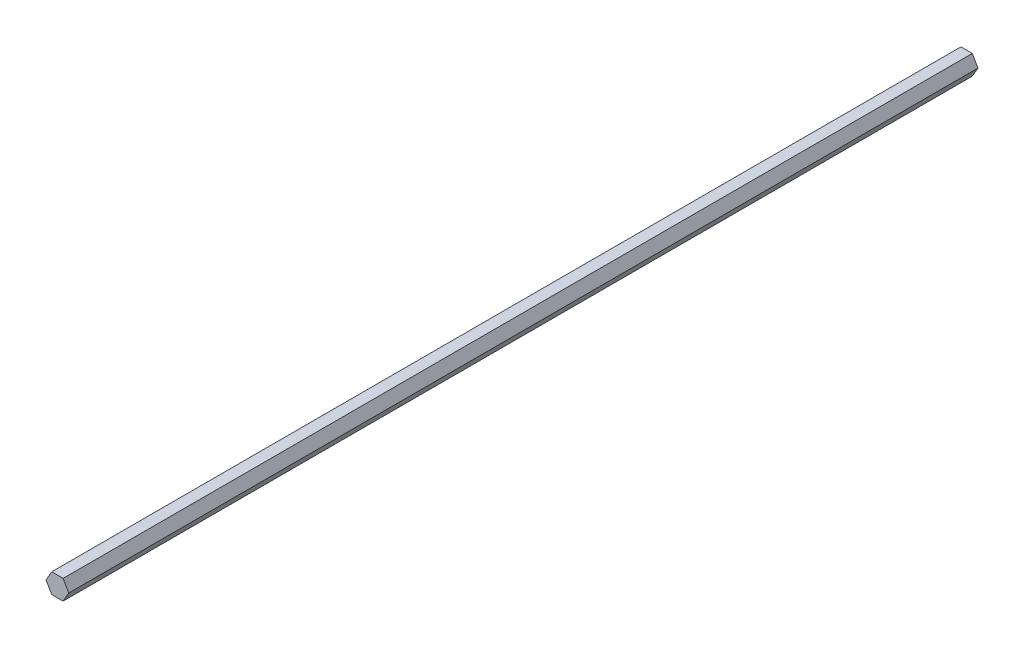
ISO-10303-21;
HEADER;
FILE_DESCRIPTION(('STEP AP214'),'2;1');
FILE_NAME('part.step','',(''),(''),'','','');
FILE_SCHEMA(('AUTOMOTIVE_DESIGN { 1 0 10303 214 1 1 1 1 }'));
ENDSEC;
DATA;
#1=APPLICATION_CONTEXT('core data for automotive mechanical design processes');
#2=APPLICATION_PROTOCOL_DEFINITION('international standard','automotive_design',2000,#1);
#3=PRODUCT_CONTEXT('',#1,'mechanical');
#4=PRODUCT('Part','Part','',(#3));
#5=PRODUCT_RELATED_PRODUCT_CATEGORY('part','',(#4));
#6=PRODUCT_DEFINITION_FORMATION('','',#4);
#7=PRODUCT_DEFINITION_CONTEXT('part definition',#1,'design');
#8=PRODUCT_DEFINITION('design','',#6,#7);
#9=PRODUCT_DEFINITION_SHAPE('','',#8);
#10=(LENGTH_UNIT() NAMED_UNIT(*) SI_UNIT(.MILLI.,.METRE.));
#11=(NAMED_UNIT(*) PLANE_ANGLE_UNIT() SI_UNIT($,.RADIAN.));
#12=(NAMED_UNIT(*) SI_UNIT($,.STERADIAN.) SOLID_ANGLE_UNIT());
#13=UNCERTAINTY_MEASURE_WITH_UNIT(LENGTH_MEASURE(1.E-05),#10,'distance_accuracy_value','');
#14=(GEOMETRIC_REPRESENTATION_CONTEXT(3) GLOBAL_UNCERTAINTY_ASSIGNED_CONTEXT((#13)) GLOBAL_UNIT_ASSIGNED_CONTEXT((#10,
#11,#12)) REPRESENTATION_CONTEXT('',''));
#15=CARTESIAN_POINT('',(0.,0.,0.));
#16=DIRECTION('',(0.,0.,1.));
#17=DIRECTION('',(1.,0.,0.));
#18=AXIS2_PLACEMENT_3D('',#15,#16,#17);
#19=CARTESIAN_POINT('',(-3.66617420935413,-6.35,292.89375));
#20=DIRECTION('',(0.,1.,0.));
#21=DIRECTION('',(0.,0.,1.));
#22=AXIS2_PLACEMENT_3D('',#19,#20,#21);
#23=PLANE('',#22);
#24=DIRECTION('',(1.,0.,0.));
#25=VECTOR('',#24,1.);
#26=CARTESIAN_POINT('',(-3.66617420935413,-6.35,-292.89375));
#27=LINE('',#26,#25);
#28=CARTESIAN_POINT('',(-3.66617420935413,-6.35,-292.89375));
#29=VERTEX_POINT('',#28);
#30=CARTESIAN_POINT('',(3.66617420935412,-6.35,-292.89375));
#31=VERTEX_POINT('',#30);
#32=EDGE_CURVE('E121',#29,#31,#27,.T.);
#33=ORIENTED_EDGE('',*,*,#32,.T.);
#34=DIRECTION('',(0.,0.,-1.));
#35=VECTOR('',#34,1.);
#36=CARTESIAN_POINT('',(3.66617420935412,-6.35,292.89375));
#37=LINE('',#36,#35);
#38=CARTESIAN_POINT('',(3.66617420935412,-6.35,292.89375));
#39=VERTEX_POINT('',#38);
#40=EDGE_CURVE('E11',#39,#31,#37,.T.);
#41=ORIENTED_EDGE('',*,*,#40,.F.);
#42=DIRECTION('',(1.,0.,0.));
#43=VECTOR('',#42,1.);
#44=CARTESIAN_POINT('',(-3.66617420935413,-6.35,292.89375));
#45=LINE('',#44,#43);
#46=CARTESIAN_POINT('',(-3.66617420935413,-6.35,292.89375));
#47=VERTEX_POINT('',#46);
#48=EDGE_CURVE('E131',#47,#39,#45,.T.);
#49=ORIENTED_EDGE('',*,*,#48,.F.);
#50=DIRECTION('',(0.,0.,-1.));
#51=VECTOR('',#50,1.);
#52=CARTESIAN_POINT('',(-3.66617420935413,-6.35,292.89375));
#53=LINE('',#52,#51);
#54=EDGE_CURVE('E117',#47,#29,#53,.T.);
#55=ORIENTED_EDGE('',*,*,#54,.T.);
#56=EDGE_LOOP('',(#33,#41,#49,#55));
#57=FACE_BOUND('',#56,.T.);
#58=ADVANCED_FACE('F37',(#57),#23,.F.);
#59=CARTESIAN_POINT('',(3.66617420935412,-6.35,292.89375));
#60=DIRECTION('',(-0.866025403784438,0.5,0.));
#61=DIRECTION('',(-0.5,-0.866025403784439,0.));
#62=AXIS2_PLACEMENT_3D('',#59,#60,#61);
#63=PLANE('',#62);
#64=DIRECTION('',(0.5,0.866025403784439,0.));
#65=VECTOR('',#64,1.);
#66=CARTESIAN_POINT('',(3.66617420935412,-6.35,-292.89375));
#67=LINE('',#66,#65);
#68=CARTESIAN_POINT('',(7.33234841870825,0.,-292.89375));
#69=VERTEX_POINT('',#68);
#70=EDGE_CURVE('E124',#31,#69,#67,.T.);
#71=ORIENTED_EDGE('',*,*,#70,.T.);
#72=DIRECTION('',(0.,0.,-1.));
#73=VECTOR('',#72,1.);
#74=CARTESIAN_POINT('',(7.33234841870825,0.,292.89375));
#75=LINE('',#74,#73);
#76=CARTESIAN_POINT('',(7.33234841870825,0.,292.89375));
#77=VERTEX_POINT('',#76);
#78=EDGE_CURVE('E45',#77,#69,#75,.T.);
#79=ORIENTED_EDGE('',*,*,#78,.F.);
#80=DIRECTION('',(0.5,0.866025403784439,0.));
#81=VECTOR('',#80,1.);
#82=CARTESIAN_POINT('',(3.66617420935412,-6.35,292.89375));
#83=LINE('',#82,#81);
#84=EDGE_CURVE('E90',#39,#77,#83,.T.);
#85=ORIENTED_EDGE('',*,*,#84,.F.);
#86=ORIENTED_EDGE('',*,*,#40,.T.);
#87=EDGE_LOOP('',(#71,#79,#85,#86));
#88=FACE_BOUND('',#87,.T.);
#89=ADVANCED_FACE('F155',(#88),#63,.F.);
#90=CARTESIAN_POINT('',(7.33234841870825,0.,292.89375));
#91=DIRECTION('',(-0.866025403784439,-0.5,0.));
#92=DIRECTION('',(0.5,-0.866025403784439,0.));
#93=AXIS2_PLACEMENT_3D('',#90,#91,#92);
#94=PLANE('',#93);
#95=DIRECTION('',(-0.5,0.866025403784439,0.));
#96=VECTOR('',#95,1.);
#97=CARTESIAN_POINT('',(7.33234841870825,0.,-292.89375));
#98=LINE('',#97,#96);
#99=CARTESIAN_POINT('',(3.66617420935413,6.35,-292.89375));
#100=VERTEX_POINT('',#99);
#101=EDGE_CURVE('E126',#69,#100,#98,.T.);
#102=ORIENTED_EDGE('',*,*,#101,.T.);
#103=DIRECTION('',(0.,0.,-1.));
#104=VECTOR('',#103,1.);
#105=CARTESIAN_POINT('',(3.66617420935413,6.35,292.89375));
#106=LINE('',#105,#104);
#107=CARTESIAN_POINT('',(3.66617420935413,6.35,292.89375));
#108=VERTEX_POINT('',#107);
#109=EDGE_CURVE('E112',#108,#100,#106,.T.);
#110=ORIENTED_EDGE('',*,*,#109,.F.);
#111=DIRECTION('',(-0.5,0.866025403784439,0.));
#112=VECTOR('',#111,1.);
#113=CARTESIAN_POINT('',(7.33234841870825,0.,292.89375));
#114=LINE('',#113,#112);
#115=EDGE_CURVE('E103',#77,#108,#114,.T.);
#116=ORIENTED_EDGE('',*,*,#115,.F.);
#117=ORIENTED_EDGE('',*,*,#78,.T.);
#118=EDGE_LOOP('',(#102,#110,#116,#117));
#119=FACE_BOUND('',#118,.T.);
#120=ADVANCED_FACE('F137',(#119),#94,.F.);
#121=CARTESIAN_POINT('',(3.66617420935413,6.35,292.89375));
#122=DIRECTION('',(0.,-1.,0.));
#123=DIRECTION('',(1.,0.,0.));
#124=AXIS2_PLACEMENT_3D('',#121,#122,#123);
#125=PLANE('',#124);
#126=DIRECTION('',(-1.,0.,0.));
#127=VECTOR('',#126,1.);
#128=CARTESIAN_POINT('',(3.66617420935413,6.35,-292.89375));
#129=LINE('',#128,#127);
#130=CARTESIAN_POINT('',(-3.66617420935413,6.35,-292.89375));
#131=VERTEX_POINT('',#130);
#132=EDGE_CURVE('E111',#100,#131,#129,.T.);
#133=ORIENTED_EDGE('',*,*,#132,.T.);
#134=DIRECTION('',(0.,0.,-1.));
#135=VECTOR('',#134,1.);
#136=CARTESIAN_POINT('',(-3.66617420935413,6.35,292.89375));
#137=LINE('',#136,#135);
#138=CARTESIAN_POINT('',(-3.66617420935413,6.35,292.89375));
#139=VERTEX_POINT('',#138);
#140=EDGE_CURVE('E108',#139,#131,#137,.T.);
#141=ORIENTED_EDGE('',*,*,#140,.F.);
#142=DIRECTION('',(-1.,0.,0.));
#143=VECTOR('',#142,1.);
#144=CARTESIAN_POINT('',(3.66617420935413,6.35,292.89375));
#145=LINE('',#144,#143);
#146=EDGE_CURVE('E97',#108,#139,#145,.T.);
#147=ORIENTED_EDGE('',*,*,#146,.F.);
#148=ORIENTED_EDGE('',*,*,#109,.T.);
#149=EDGE_LOOP('',(#133,#141,#147,#148));
#150=FACE_BOUND('',#149,.T.);
#151=ADVANCED_FACE('F109',(#150),#125,.F.);
#152=CARTESIAN_POINT('',(-3.66617420935413,6.35,292.89375));
#153=DIRECTION('',(0.866025403784439,-0.5,0.));
#154=DIRECTION('',(0.5,0.866025403784438,0.));
#155=AXIS2_PLACEMENT_3D('',#152,#153,#154);
#156=PLANE('',#155);
#157=DIRECTION('',(-0.5,-0.866025403784439,0.));
#158=VECTOR('',#157,1.);
#159=CARTESIAN_POINT('',(-3.66617420935413,6.35,-292.89375));
#160=LINE('',#159,#158);
#161=CARTESIAN_POINT('',(-7.33234841870825,0.,-292.89375));
#162=VERTEX_POINT('',#161);
#163=EDGE_CURVE('E76',#131,#162,#160,.T.);
#164=ORIENTED_EDGE('',*,*,#163,.T.);
#165=DIRECTION('',(0.,0.,-1.));
#166=VECTOR('',#165,1.);
#167=CARTESIAN_POINT('',(-7.33234841870825,0.,292.89375));
#168=LINE('',#167,#166);
#169=CARTESIAN_POINT('',(-7.33234841870825,0.,292.89375));
#170=VERTEX_POINT('',#169);
#171=EDGE_CURVE('E113',#170,#162,#168,.T.);
#172=ORIENTED_EDGE('',*,*,#171,.F.);
#173=DIRECTION('',(-0.5,-0.866025403784439,0.));
#174=VECTOR('',#173,1.);
#175=CARTESIAN_POINT('',(-3.66617420935413,6.35,292.89375));
#176=LINE('',#175,#174);
#177=EDGE_CURVE('E101',#139,#170,#176,.T.);
#178=ORIENTED_EDGE('',*,*,#177,.F.);
#179=ORIENTED_EDGE('',*,*,#140,.T.);
#180=EDGE_LOOP('',(#164,#172,#178,#179));
#181=FACE_BOUND('',#180,.T.);
#182=ADVANCED_FACE('F115',(#181),#156,.F.);
#183=CARTESIAN_POINT('',(-7.33234841870825,0.,292.89375));
#184=DIRECTION('',(0.866025403784439,0.5,0.));
#185=DIRECTION('',(-0.5,0.866025403784439,0.));
#186=AXIS2_PLACEMENT_3D('',#183,#184,#185);
#187=PLANE('',#186);
#188=DIRECTION('',(0.5,-0.866025403784439,0.));
#189=VECTOR('',#188,1.);
#190=CARTESIAN_POINT('',(-7.33234841870825,0.,-292.89375));
#191=LINE('',#190,#189);
#192=EDGE_CURVE('E82',#162,#29,#191,.T.);
#193=ORIENTED_EDGE('',*,*,#192,.T.);
#194=ORIENTED_EDGE('',*,*,#54,.F.);
#195=DIRECTION('',(0.5,-0.866025403784439,0.));
#196=VECTOR('',#195,1.);
#197=CARTESIAN_POINT('',(-7.33234841870825,0.,292.89375));
#198=LINE('',#197,#196);
#199=EDGE_CURVE('E53',#170,#47,#198,.T.);
#200=ORIENTED_EDGE('',*,*,#199,.F.);
#201=ORIENTED_EDGE('',*,*,#171,.T.);
#202=EDGE_LOOP('',(#193,#194,#200,#201));
#203=FACE_BOUND('',#202,.T.);
#204=ADVANCED_FACE('F144',(#203),#187,.F.);
#205=CARTESIAN_POINT('',(0.,0.,292.89375));
#206=DIRECTION('',(0.,0.,1.));
#207=DIRECTION('',(1.,0.,0.));
#208=AXIS2_PLACEMENT_3D('',#205,#206,#207);
#209=PLANE('',#208);
#210=ORIENTED_EDGE('',*,*,#48,.T.);
#211=ORIENTED_EDGE('',*,*,#84,.T.);
#212=ORIENTED_EDGE('',*,*,#115,.T.);
#213=ORIENTED_EDGE('',*,*,#146,.T.);
#214=ORIENTED_EDGE('',*,*,#177,.T.);
#215=ORIENTED_EDGE('',*,*,#199,.T.);
#216=EDGE_LOOP('',(#210,#211,#212,#213,#214,#215));
#217=FACE_BOUND('',#216,.T.);
#218=ADVANCED_FACE('F99',(#217),#209,.T.);
#219=CARTESIAN_POINT('',(0.,0.,-292.89375));
#220=DIRECTION('',(0.,0.,1.));
#221=DIRECTION('',(1.,0.,0.));
#222=AXIS2_PLACEMENT_3D('',#219,#220,#221);
#223=PLANE('',#222);
#224=ORIENTED_EDGE('',*,*,#32,.F.);
#225=ORIENTED_EDGE('',*,*,#192,.F.);
#226=ORIENTED_EDGE('',*,*,#163,.F.);
#227=ORIENTED_EDGE('',*,*,#132,.F.);
#228=ORIENTED_EDGE('',*,*,#101,.F.);
#229=ORIENTED_EDGE('',*,*,#70,.F.);
#230=EDGE_LOOP('',(#224,#225,#226,#227,#228,#229));
#231=FACE_BOUND('',#230,.T.);
#232=ADVANCED_FACE('F140',(#231),#223,.F.);
#233=CLOSED_SHELL('',(#58,#89,#120,#151,#182,#204,#218,#232));
#234=MANIFOLD_SOLID_BREP('B2',#233);
#235=ADVANCED_BREP_SHAPE_REPRESENTATION('',(#18,#234),#14);
#236=SHAPE_DEFINITION_REPRESENTATION(#9,#235);
ENDSEC;
END-ISO-10303-21;
